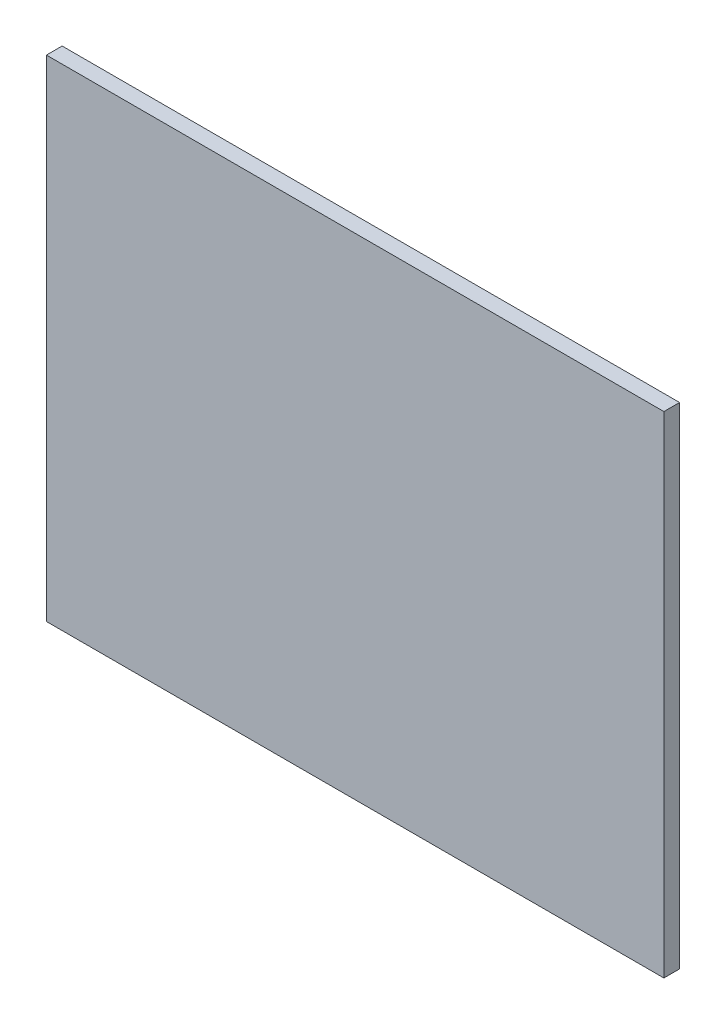
ISO-10303-21;
HEADER;
FILE_DESCRIPTION(('STEP AP214'),'2;1');
FILE_NAME('part.step','',(''),(''),'','','');
FILE_SCHEMA(('AUTOMOTIVE_DESIGN { 1 0 10303 214 1 1 1 1 }'));
ENDSEC;
DATA;
#1=APPLICATION_CONTEXT('core data for automotive mechanical design processes');
#2=APPLICATION_PROTOCOL_DEFINITION('international standard','automotive_design',2000,#1);
#3=PRODUCT_CONTEXT('',#1,'mechanical');
#4=PRODUCT('Part','Part','',(#3));
#5=PRODUCT_RELATED_PRODUCT_CATEGORY('part','',(#4));
#6=PRODUCT_DEFINITION_FORMATION('','',#4);
#7=PRODUCT_DEFINITION_CONTEXT('part definition',#1,'design');
#8=PRODUCT_DEFINITION('design','',#6,#7);
#9=PRODUCT_DEFINITION_SHAPE('','',#8);
#10=(LENGTH_UNIT() NAMED_UNIT(*) SI_UNIT(.MILLI.,.METRE.));
#11=(NAMED_UNIT(*) PLANE_ANGLE_UNIT() SI_UNIT($,.RADIAN.));
#12=(NAMED_UNIT(*) SI_UNIT($,.STERADIAN.) SOLID_ANGLE_UNIT());
#13=UNCERTAINTY_MEASURE_WITH_UNIT(LENGTH_MEASURE(1.E-05),#10,'distance_accuracy_value','');
#14=(GEOMETRIC_REPRESENTATION_CONTEXT(3) GLOBAL_UNCERTAINTY_ASSIGNED_CONTEXT((#13)) GLOBAL_UNIT_ASSIGNED_CONTEXT((#10,
#11,#12)) REPRESENTATION_CONTEXT('',''));
#15=CARTESIAN_POINT('',(0.,0.,0.));
#16=DIRECTION('',(0.,0.,1.));
#17=DIRECTION('',(1.,0.,0.));
#18=AXIS2_PLACEMENT_3D('',#15,#16,#17);
#19=CARTESIAN_POINT('',(236.,-187.5,6.));
#20=DIRECTION('',(-1.,0.,0.));
#21=DIRECTION('',(0.,0.,1.));
#22=AXIS2_PLACEMENT_3D('',#19,#20,#21);
#23=PLANE('',#22);
#24=DIRECTION('',(0.,1.,0.));
#25=VECTOR('',#24,1.);
#26=CARTESIAN_POINT('',(236.,-187.5,-6.));
#27=LINE('',#26,#25);
#28=CARTESIAN_POINT('',(236.,-187.5,-6.));
#29=VERTEX_POINT('',#28);
#30=CARTESIAN_POINT('',(236.,187.5,-6.));
#31=VERTEX_POINT('',#30);
#32=EDGE_CURVE('E100',#29,#31,#27,.T.);
#33=ORIENTED_EDGE('',*,*,#32,.T.);
#34=DIRECTION('',(0.,0.,-1.));
#35=VECTOR('',#34,1.);
#36=CARTESIAN_POINT('',(236.,187.5,6.));
#37=LINE('',#36,#35);
#38=CARTESIAN_POINT('',(236.,187.5,6.));
#39=VERTEX_POINT('',#38);
#40=EDGE_CURVE('E11',#39,#31,#37,.T.);
#41=ORIENTED_EDGE('',*,*,#40,.F.);
#42=DIRECTION('',(0.,1.,0.));
#43=VECTOR('',#42,1.);
#44=CARTESIAN_POINT('',(236.,-187.5,6.));
#45=LINE('',#44,#43);
#46=CARTESIAN_POINT('',(236.,-187.5,6.));
#47=VERTEX_POINT('',#46);
#48=EDGE_CURVE('E87',#47,#39,#45,.T.);
#49=ORIENTED_EDGE('',*,*,#48,.F.);
#50=DIRECTION('',(0.,0.,-1.));
#51=VECTOR('',#50,1.);
#52=CARTESIAN_POINT('',(236.,-187.5,6.));
#53=LINE('',#52,#51);
#54=EDGE_CURVE('E96',#47,#29,#53,.T.);
#55=ORIENTED_EDGE('',*,*,#54,.T.);
#56=EDGE_LOOP('',(#33,#41,#49,#55));
#57=FACE_BOUND('',#56,.T.);
#58=ADVANCED_FACE('F34',(#57),#23,.F.);
#59=CARTESIAN_POINT('',(-236.,187.5,6.));
#60=DIRECTION('',(0.,-1.,0.));
#61=DIRECTION('',(0.,0.,-1.));
#62=AXIS2_PLACEMENT_3D('',#59,#60,#61);
#63=PLANE('',#62);
#64=DIRECTION('',(-1.,0.,0.));
#65=VECTOR('',#64,1.);
#66=CARTESIAN_POINT('',(-236.,187.5,-6.));
#67=LINE('',#66,#65);
#68=CARTESIAN_POINT('',(-236.,187.5,-6.));
#69=VERTEX_POINT('',#68);
#70=EDGE_CURVE('E91',#31,#69,#67,.T.);
#71=ORIENTED_EDGE('',*,*,#70,.T.);
#72=DIRECTION('',(0.,0.,-1.));
#73=VECTOR('',#72,1.);
#74=CARTESIAN_POINT('',(-236.,187.5,6.));
#75=LINE('',#74,#73);
#76=CARTESIAN_POINT('',(-236.,187.5,6.));
#77=VERTEX_POINT('',#76);
#78=EDGE_CURVE('E43',#77,#69,#75,.T.);
#79=ORIENTED_EDGE('',*,*,#78,.F.);
#80=DIRECTION('',(-1.,0.,0.));
#81=VECTOR('',#80,1.);
#82=CARTESIAN_POINT('',(-236.,187.5,6.));
#83=LINE('',#82,#81);
#84=EDGE_CURVE('E82',#39,#77,#83,.T.);
#85=ORIENTED_EDGE('',*,*,#84,.F.);
#86=ORIENTED_EDGE('',*,*,#40,.T.);
#87=EDGE_LOOP('',(#71,#79,#85,#86));
#88=FACE_BOUND('',#87,.T.);
#89=ADVANCED_FACE('F90',(#88),#63,.F.);
#90=CARTESIAN_POINT('',(-236.,-187.5,6.));
#91=DIRECTION('',(1.,0.,0.));
#92=DIRECTION('',(0.,0.,-1.));
#93=AXIS2_PLACEMENT_3D('',#90,#91,#92);
#94=PLANE('',#93);
#95=DIRECTION('',(0.,-1.,0.));
#96=VECTOR('',#95,1.);
#97=CARTESIAN_POINT('',(-236.,-187.5,-6.));
#98=LINE('',#97,#96);
#99=CARTESIAN_POINT('',(-236.,-187.5,-6.));
#100=VERTEX_POINT('',#99);
#101=EDGE_CURVE('E69',#69,#100,#98,.T.);
#102=ORIENTED_EDGE('',*,*,#101,.T.);
#103=DIRECTION('',(0.,0.,-1.));
#104=VECTOR('',#103,1.);
#105=CARTESIAN_POINT('',(-236.,-187.5,6.));
#106=LINE('',#105,#104);
#107=CARTESIAN_POINT('',(-236.,-187.5,6.));
#108=VERTEX_POINT('',#107);
#109=EDGE_CURVE('E92',#108,#100,#106,.T.);
#110=ORIENTED_EDGE('',*,*,#109,.F.);
#111=DIRECTION('',(0.,-1.,0.));
#112=VECTOR('',#111,1.);
#113=CARTESIAN_POINT('',(-236.,-187.5,6.));
#114=LINE('',#113,#112);
#115=EDGE_CURVE('E85',#77,#108,#114,.T.);
#116=ORIENTED_EDGE('',*,*,#115,.F.);
#117=ORIENTED_EDGE('',*,*,#78,.T.);
#118=EDGE_LOOP('',(#102,#110,#116,#117));
#119=FACE_BOUND('',#118,.T.);
#120=ADVANCED_FACE('F94',(#119),#94,.F.);
#121=CARTESIAN_POINT('',(-236.,-187.5,6.));
#122=DIRECTION('',(0.,1.,0.));
#123=DIRECTION('',(0.,0.,1.));
#124=AXIS2_PLACEMENT_3D('',#121,#122,#123);
#125=PLANE('',#124);
#126=DIRECTION('',(1.,0.,0.));
#127=VECTOR('',#126,1.);
#128=CARTESIAN_POINT('',(-236.,-187.5,-6.));
#129=LINE('',#128,#127);
#130=EDGE_CURVE('E75',#100,#29,#129,.T.);
#131=ORIENTED_EDGE('',*,*,#130,.T.);
#132=ORIENTED_EDGE('',*,*,#54,.F.);
#133=DIRECTION('',(1.,0.,0.));
#134=VECTOR('',#133,1.);
#135=CARTESIAN_POINT('',(-236.,-187.5,6.));
#136=LINE('',#135,#134);
#137=EDGE_CURVE('E52',#108,#47,#136,.T.);
#138=ORIENTED_EDGE('',*,*,#137,.F.);
#139=ORIENTED_EDGE('',*,*,#109,.T.);
#140=EDGE_LOOP('',(#131,#132,#138,#139));
#141=FACE_BOUND('',#140,.T.);
#142=ADVANCED_FACE('F210',(#141),#125,.F.);
#143=CARTESIAN_POINT('',(0.,0.,6.));
#144=DIRECTION('',(0.,0.,-1.));
#145=DIRECTION('',(-1.,0.,0.));
#146=AXIS2_PLACEMENT_3D('',#143,#144,#145);
#147=PLANE('',#146);
#148=ORIENTED_EDGE('',*,*,#48,.T.);
#149=ORIENTED_EDGE('',*,*,#84,.T.);
#150=ORIENTED_EDGE('',*,*,#115,.T.);
#151=ORIENTED_EDGE('',*,*,#137,.T.);
#152=EDGE_LOOP('',(#148,#149,#150,#151));
#153=FACE_BOUND('',#152,.T.);
#154=ADVANCED_FACE('F83',(#153),#147,.F.);
#155=CARTESIAN_POINT('',(0.,0.,-6.));
#156=DIRECTION('',(0.,0.,-1.));
#157=DIRECTION('',(-1.,0.,0.));
#158=AXIS2_PLACEMENT_3D('',#155,#156,#157);
#159=PLANE('',#158);
#160=CARTESIAN_POINT('',(230.000000000001,140.,-6.));
#161=DIRECTION('',(0.,0.,-1.));
#162=DIRECTION('',(-1.,0.,0.));
#163=AXIS2_PLACEMENT_3D('',#160,#161,#162);
#164=CIRCLE('',#163,2.99999999999999);
#165=CARTESIAN_POINT('',(227.000000000001,140.,-6.));
#166=VERTEX_POINT('',#165);
#167=EDGE_CURVE('E37',#166,#166,#164,.T.);
#168=ORIENTED_EDGE('',*,*,#167,.F.);
#169=EDGE_LOOP('',(#168));
#170=FACE_BOUND('',#169,.T.);
#171=CARTESIAN_POINT('',(230.,70.,-6.));
#172=DIRECTION('',(0.,0.,-1.));
#173=DIRECTION('',(-1.,0.,0.));
#174=AXIS2_PLACEMENT_3D('',#171,#172,#173);
#175=CIRCLE('',#174,2.99999999999999);
#176=CARTESIAN_POINT('',(227.,70.,-6.));
#177=VERTEX_POINT('',#176);
#178=EDGE_CURVE('E147',#177,#177,#175,.T.);
#179=ORIENTED_EDGE('',*,*,#178,.F.);
#180=EDGE_LOOP('',(#179));
#181=FACE_BOUND('',#180,.T.);
#182=CARTESIAN_POINT('',(230.,-70.,-6.));
#183=DIRECTION('',(0.,0.,-1.));
#184=DIRECTION('',(-1.,0.,0.));
#185=AXIS2_PLACEMENT_3D('',#182,#183,#184);
#186=CIRCLE('',#185,2.99999999999999);
#187=CARTESIAN_POINT('',(227.,-70.,-6.));
#188=VERTEX_POINT('',#187);
#189=EDGE_CURVE('E144',#188,#188,#186,.T.);
#190=ORIENTED_EDGE('',*,*,#189,.F.);
#191=EDGE_LOOP('',(#190));
#192=FACE_BOUND('',#191,.T.);
#193=CARTESIAN_POINT('',(230.000000000001,-140.,-6.));
#194=DIRECTION('',(0.,0.,-1.));
#195=DIRECTION('',(-1.,0.,0.));
#196=AXIS2_PLACEMENT_3D('',#193,#194,#195);
#197=CIRCLE('',#196,2.99999999999999);
#198=CARTESIAN_POINT('',(227.000000000001,-140.,-6.));
#199=VERTEX_POINT('',#198);
#200=EDGE_CURVE('E140',#199,#199,#197,.T.);
#201=ORIENTED_EDGE('',*,*,#200,.F.);
#202=EDGE_LOOP('',(#201));
#203=FACE_BOUND('',#202,.T.);
#204=CARTESIAN_POINT('',(-230.,-70.,-6.));
#205=DIRECTION('',(0.,0.,-1.));
#206=DIRECTION('',(-1.,0.,0.));
#207=AXIS2_PLACEMENT_3D('',#204,#205,#206);
#208=CIRCLE('',#207,2.99999999999999);
#209=CARTESIAN_POINT('',(-233.,-70.,-6.));
#210=VERTEX_POINT('',#209);
#211=EDGE_CURVE('E136',#210,#210,#208,.T.);
#212=ORIENTED_EDGE('',*,*,#211,.F.);
#213=EDGE_LOOP('',(#212));
#214=FACE_BOUND('',#213,.T.);
#215=CARTESIAN_POINT('',(-230.,-140.,-6.));
#216=DIRECTION('',(0.,0.,-1.));
#217=DIRECTION('',(-1.,0.,0.));
#218=AXIS2_PLACEMENT_3D('',#215,#216,#217);
#219=CIRCLE('',#218,2.99999999999999);
#220=CARTESIAN_POINT('',(-233.,-140.,-6.));
#221=VERTEX_POINT('',#220);
#222=EDGE_CURVE('E132',#221,#221,#219,.T.);
#223=ORIENTED_EDGE('',*,*,#222,.F.);
#224=EDGE_LOOP('',(#223));
#225=FACE_BOUND('',#224,.T.);
#226=CARTESIAN_POINT('',(182.712951508879,181.5,-6.));
#227=DIRECTION('',(0.,0.,-1.));
#228=DIRECTION('',(-1.,0.,0.));
#229=AXIS2_PLACEMENT_3D('',#226,#227,#228);
#230=CIRCLE('',#229,2.99999999999999);
#231=CARTESIAN_POINT('',(179.712951508879,181.5,-6.));
#232=VERTEX_POINT('',#231);
#233=EDGE_CURVE('E128',#232,#232,#230,.T.);
#234=ORIENTED_EDGE('',*,*,#233,.F.);
#235=EDGE_LOOP('',(#234));
#236=FACE_BOUND('',#235,.T.);
#237=CARTESIAN_POINT('',(-92.7129515088792,181.5,-6.));
#238=DIRECTION('',(0.,0.,-1.));
#239=DIRECTION('',(-1.,0.,0.));
#240=AXIS2_PLACEMENT_3D('',#237,#238,#239);
#241=CIRCLE('',#240,2.99999999999999);
#242=CARTESIAN_POINT('',(-95.7129515088792,181.5,-6.));
#243=VERTEX_POINT('',#242);
#244=EDGE_CURVE('E124',#243,#243,#241,.T.);
#245=ORIENTED_EDGE('',*,*,#244,.F.);
#246=EDGE_LOOP('',(#245));
#247=FACE_BOUND('',#246,.T.);
#248=CARTESIAN_POINT('',(92.7129515088793,181.5,-6.));
#249=DIRECTION('',(0.,0.,-1.));
#250=DIRECTION('',(-1.,0.,0.));
#251=AXIS2_PLACEMENT_3D('',#248,#249,#250);
#252=CIRCLE('',#251,2.99999999999999);
#253=CARTESIAN_POINT('',(89.7129515088794,181.5,-6.));
#254=VERTEX_POINT('',#253);
#255=EDGE_CURVE('E120',#254,#254,#252,.T.);
#256=ORIENTED_EDGE('',*,*,#255,.F.);
#257=EDGE_LOOP('',(#256));
#258=FACE_BOUND('',#257,.T.);
#259=CARTESIAN_POINT('',(-182.712951508879,181.5,-6.));
#260=DIRECTION('',(0.,0.,-1.));
#261=DIRECTION('',(-1.,0.,0.));
#262=AXIS2_PLACEMENT_3D('',#259,#260,#261);
#263=CIRCLE('',#262,2.99999999999999);
#264=CARTESIAN_POINT('',(-185.712951508879,181.5,-6.));
#265=VERTEX_POINT('',#264);
#266=EDGE_CURVE('E116',#265,#265,#263,.T.);
#267=ORIENTED_EDGE('',*,*,#266,.F.);
#268=EDGE_LOOP('',(#267));
#269=FACE_BOUND('',#268,.T.);
#270=CARTESIAN_POINT('',(-230.,140.,-6.));
#271=DIRECTION('',(0.,0.,-1.));
#272=DIRECTION('',(-1.,0.,0.));
#273=AXIS2_PLACEMENT_3D('',#270,#271,#272);
#274=CIRCLE('',#273,2.99999999999999);
#275=CARTESIAN_POINT('',(-233.,140.,-6.));
#276=VERTEX_POINT('',#275);
#277=EDGE_CURVE('E112',#276,#276,#274,.T.);
#278=ORIENTED_EDGE('',*,*,#277,.F.);
#279=EDGE_LOOP('',(#278));
#280=FACE_BOUND('',#279,.T.);
#281=CARTESIAN_POINT('',(-230.,70.,-6.));
#282=DIRECTION('',(0.,0.,-1.));
#283=DIRECTION('',(-1.,0.,0.));
#284=AXIS2_PLACEMENT_3D('',#281,#282,#283);
#285=CIRCLE('',#284,2.99999999999999);
#286=CARTESIAN_POINT('',(-233.,70.,-6.));
#287=VERTEX_POINT('',#286);
#288=EDGE_CURVE('E103',#287,#287,#285,.T.);
#289=ORIENTED_EDGE('',*,*,#288,.F.);
#290=EDGE_LOOP('',(#289));
#291=FACE_BOUND('',#290,.T.);
#292=ORIENTED_EDGE('',*,*,#32,.F.);
#293=ORIENTED_EDGE('',*,*,#130,.F.);
#294=ORIENTED_EDGE('',*,*,#101,.F.);
#295=ORIENTED_EDGE('',*,*,#70,.F.);
#296=EDGE_LOOP('',(#292,#293,#294,#295));
#297=FACE_BOUND('',#296,.T.);
#298=ADVANCED_FACE('F194',(#170,#181,#192,#203,#214,#225,#236,#247,#258,#269,#280,#291,#297),
#159,.T.);
#299=CARTESIAN_POINT('',(-230.,70.,-12.));
#300=DIRECTION('',(0.,0.,1.));
#301=DIRECTION('',(1.,0.,0.));
#302=AXIS2_PLACEMENT_3D('',#299,#300,#301);
#303=CYLINDRICAL_SURFACE('',#302,2.99999999999999);
#304=ORIENTED_EDGE('',*,*,#288,.T.);
#305=EDGE_LOOP('',(#304));
#306=FACE_BOUND('',#305,.T.);
#307=CARTESIAN_POINT('',(-230.,70.,0.));
#308=DIRECTION('',(0.,0.,1.));
#309=DIRECTION('',(1.,0.,0.));
#310=AXIS2_PLACEMENT_3D('',#307,#308,#309);
#311=CIRCLE('',#310,2.99999999999999);
#312=CARTESIAN_POINT('',(-227.,70.,0.));
#313=VERTEX_POINT('',#312);
#314=EDGE_CURVE('E111',#313,#313,#311,.T.);
#315=ORIENTED_EDGE('',*,*,#314,.T.);
#316=EDGE_LOOP('',(#315));
#317=FACE_BOUND('',#316,.T.);
#318=ADVANCED_FACE('F181',(#306,#317),#303,.F.);
#319=CARTESIAN_POINT('',(-230.,70.,0.));
#320=DIRECTION('',(0.,0.,1.));
#321=DIRECTION('',(1.,0.,0.));
#322=AXIS2_PLACEMENT_3D('',#319,#320,#321);
#323=PLANE('',#322);
#324=ORIENTED_EDGE('',*,*,#314,.F.);
#325=EDGE_LOOP('',(#324));
#326=FACE_BOUND('',#325,.T.);
#327=ADVANCED_FACE('F183',(#326),#323,.F.);
#328=CARTESIAN_POINT('',(-230.,140.,-12.));
#329=DIRECTION('',(0.,0.,1.));
#330=DIRECTION('',(1.,0.,0.));
#331=AXIS2_PLACEMENT_3D('',#328,#329,#330);
#332=CYLINDRICAL_SURFACE('',#331,2.99999999999999);
#333=ORIENTED_EDGE('',*,*,#277,.T.);
#334=EDGE_LOOP('',(#333));
#335=FACE_BOUND('',#334,.T.);
#336=CARTESIAN_POINT('',(-230.,140.,0.));
#337=DIRECTION('',(0.,0.,1.));
#338=DIRECTION('',(1.,0.,0.));
#339=AXIS2_PLACEMENT_3D('',#336,#337,#338);
#340=CIRCLE('',#339,2.99999999999999);
#341=CARTESIAN_POINT('',(-227.,140.,0.));
#342=VERTEX_POINT('',#341);
#343=EDGE_CURVE('E115',#342,#342,#340,.T.);
#344=ORIENTED_EDGE('',*,*,#343,.T.);
#345=EDGE_LOOP('',(#344));
#346=FACE_BOUND('',#345,.T.);
#347=ADVANCED_FACE('F185',(#335,#346),#332,.F.);
#348=CARTESIAN_POINT('',(-230.,140.,0.));
#349=DIRECTION('',(0.,0.,1.));
#350=DIRECTION('',(1.,0.,0.));
#351=AXIS2_PLACEMENT_3D('',#348,#349,#350);
#352=PLANE('',#351);
#353=ORIENTED_EDGE('',*,*,#343,.F.);
#354=EDGE_LOOP('',(#353));
#355=FACE_BOUND('',#354,.T.);
#356=ADVANCED_FACE('F191',(#355),#352,.F.);
#357=CARTESIAN_POINT('',(-182.712951508879,181.5,-12.));
#358=DIRECTION('',(0.,0.,1.));
#359=DIRECTION('',(1.,0.,0.));
#360=AXIS2_PLACEMENT_3D('',#357,#358,#359);
#361=CYLINDRICAL_SURFACE('',#360,2.99999999999999);
#362=ORIENTED_EDGE('',*,*,#266,.T.);
#363=EDGE_LOOP('',(#362));
#364=FACE_BOUND('',#363,.T.);
#365=CARTESIAN_POINT('',(-182.712951508879,181.5,0.));
#366=DIRECTION('',(0.,0.,1.));
#367=DIRECTION('',(1.,0.,0.));
#368=AXIS2_PLACEMENT_3D('',#365,#366,#367);
#369=CIRCLE('',#368,2.99999999999999);
#370=CARTESIAN_POINT('',(-179.712951508879,181.5,0.));
#371=VERTEX_POINT('',#370);
#372=EDGE_CURVE('E119',#371,#371,#369,.T.);
#373=ORIENTED_EDGE('',*,*,#372,.T.);
#374=EDGE_LOOP('',(#373));
#375=FACE_BOUND('',#374,.T.);
#376=ADVANCED_FACE('F259',(#364,#375),#361,.F.);
#377=CARTESIAN_POINT('',(-182.712951508879,181.5,0.));
#378=DIRECTION('',(0.,0.,1.));
#379=DIRECTION('',(1.,0.,0.));
#380=AXIS2_PLACEMENT_3D('',#377,#378,#379);
#381=PLANE('',#380);
#382=ORIENTED_EDGE('',*,*,#372,.F.);
#383=EDGE_LOOP('',(#382));
#384=FACE_BOUND('',#383,.T.);
#385=ADVANCED_FACE('F269',(#384),#381,.F.);
#386=CARTESIAN_POINT('',(92.7129515088793,181.5,-12.));
#387=DIRECTION('',(0.,0.,1.));
#388=DIRECTION('',(1.,0.,0.));
#389=AXIS2_PLACEMENT_3D('',#386,#387,#388);
#390=CYLINDRICAL_SURFACE('',#389,2.99999999999999);
#391=ORIENTED_EDGE('',*,*,#255,.T.);
#392=EDGE_LOOP('',(#391));
#393=FACE_BOUND('',#392,.T.);
#394=CARTESIAN_POINT('',(92.7129515088793,181.5,0.));
#395=DIRECTION('',(0.,0.,1.));
#396=DIRECTION('',(-1.,0.,0.));
#397=AXIS2_PLACEMENT_3D('',#394,#395,#396);
#398=CIRCLE('',#397,2.99999999999999);
#399=CARTESIAN_POINT('',(89.7129515088794,181.5,0.));
#400=VERTEX_POINT('',#399);
#401=EDGE_CURVE('E123',#400,#400,#398,.T.);
#402=ORIENTED_EDGE('',*,*,#401,.T.);
#403=EDGE_LOOP('',(#402));
#404=FACE_BOUND('',#403,.T.);
#405=ADVANCED_FACE('F279',(#393,#404),#390,.F.);
#406=CARTESIAN_POINT('',(92.7129515088793,181.5,0.));
#407=DIRECTION('',(0.,0.,-1.));
#408=DIRECTION('',(-1.,0.,0.));
#409=AXIS2_PLACEMENT_3D('',#406,#407,#408);
#410=PLANE('',#409);
#411=ORIENTED_EDGE('',*,*,#401,.F.);
#412=EDGE_LOOP('',(#411));
#413=FACE_BOUND('',#412,.T.);
#414=ADVANCED_FACE('F289',(#413),#410,.T.);
#415=CARTESIAN_POINT('',(-92.7129515088792,181.5,-12.));
#416=DIRECTION('',(0.,0.,1.));
#417=DIRECTION('',(1.,0.,0.));
#418=AXIS2_PLACEMENT_3D('',#415,#416,#417);
#419=CYLINDRICAL_SURFACE('',#418,2.99999999999999);
#420=ORIENTED_EDGE('',*,*,#244,.T.);
#421=EDGE_LOOP('',(#420));
#422=FACE_BOUND('',#421,.T.);
#423=CARTESIAN_POINT('',(-92.7129515088792,181.5,0.));
#424=DIRECTION('',(0.,0.,1.));
#425=DIRECTION('',(1.,0.,0.));
#426=AXIS2_PLACEMENT_3D('',#423,#424,#425);
#427=CIRCLE('',#426,2.99999999999999);
#428=CARTESIAN_POINT('',(-89.7129515088792,181.5,0.));
#429=VERTEX_POINT('',#428);
#430=EDGE_CURVE('E127',#429,#429,#427,.T.);
#431=ORIENTED_EDGE('',*,*,#430,.T.);
#432=EDGE_LOOP('',(#431));
#433=FACE_BOUND('',#432,.T.);
#434=ADVANCED_FACE('F299',(#422,#433),#419,.F.);
#435=CARTESIAN_POINT('',(-92.7129515088792,181.5,0.));
#436=DIRECTION('',(0.,0.,1.));
#437=DIRECTION('',(1.,0.,0.));
#438=AXIS2_PLACEMENT_3D('',#435,#436,#437);
#439=PLANE('',#438);
#440=ORIENTED_EDGE('',*,*,#430,.F.);
#441=EDGE_LOOP('',(#440));
#442=FACE_BOUND('',#441,.T.);
#443=ADVANCED_FACE('F309',(#442),#439,.F.);
#444=CARTESIAN_POINT('',(182.712951508879,181.5,-12.));
#445=DIRECTION('',(0.,0.,1.));
#446=DIRECTION('',(1.,0.,0.));
#447=AXIS2_PLACEMENT_3D('',#444,#445,#446);
#448=CYLINDRICAL_SURFACE('',#447,2.99999999999999);
#449=ORIENTED_EDGE('',*,*,#233,.T.);
#450=EDGE_LOOP('',(#449));
#451=FACE_BOUND('',#450,.T.);
#452=CARTESIAN_POINT('',(182.712951508879,181.5,0.));
#453=DIRECTION('',(0.,0.,1.));
#454=DIRECTION('',(-1.,0.,0.));
#455=AXIS2_PLACEMENT_3D('',#452,#453,#454);
#456=CIRCLE('',#455,2.99999999999999);
#457=CARTESIAN_POINT('',(179.712951508879,181.5,0.));
#458=VERTEX_POINT('',#457);
#459=EDGE_CURVE('E131',#458,#458,#456,.T.);
#460=ORIENTED_EDGE('',*,*,#459,.T.);
#461=EDGE_LOOP('',(#460));
#462=FACE_BOUND('',#461,.T.);
#463=ADVANCED_FACE('F319',(#451,#462),#448,.F.);
#464=CARTESIAN_POINT('',(182.712951508879,181.5,0.));
#465=DIRECTION('',(0.,0.,-1.));
#466=DIRECTION('',(-1.,0.,0.));
#467=AXIS2_PLACEMENT_3D('',#464,#465,#466);
#468=PLANE('',#467);
#469=ORIENTED_EDGE('',*,*,#459,.F.);
#470=EDGE_LOOP('',(#469));
#471=FACE_BOUND('',#470,.T.);
#472=ADVANCED_FACE('F329',(#471),#468,.T.);
#473=CARTESIAN_POINT('',(-230.,-140.,-12.));
#474=DIRECTION('',(0.,0.,1.));
#475=DIRECTION('',(1.,0.,0.));
#476=AXIS2_PLACEMENT_3D('',#473,#474,#475);
#477=CYLINDRICAL_SURFACE('',#476,2.99999999999999);
#478=ORIENTED_EDGE('',*,*,#222,.T.);
#479=EDGE_LOOP('',(#478));
#480=FACE_BOUND('',#479,.T.);
#481=CARTESIAN_POINT('',(-230.,-140.,0.));
#482=DIRECTION('',(0.,0.,1.));
#483=DIRECTION('',(-1.,0.,0.));
#484=AXIS2_PLACEMENT_3D('',#481,#482,#483);
#485=CIRCLE('',#484,2.99999999999999);
#486=CARTESIAN_POINT('',(-233.,-140.,0.));
#487=VERTEX_POINT('',#486);
#488=EDGE_CURVE('E135',#487,#487,#485,.T.);
#489=ORIENTED_EDGE('',*,*,#488,.T.);
#490=EDGE_LOOP('',(#489));
#491=FACE_BOUND('',#490,.T.);
#492=ADVANCED_FACE('F339',(#480,#491),#477,.F.);
#493=CARTESIAN_POINT('',(-230.,-140.,0.));
#494=DIRECTION('',(0.,0.,-1.));
#495=DIRECTION('',(-1.,0.,0.));
#496=AXIS2_PLACEMENT_3D('',#493,#494,#495);
#497=PLANE('',#496);
#498=ORIENTED_EDGE('',*,*,#488,.F.);
#499=EDGE_LOOP('',(#498));
#500=FACE_BOUND('',#499,.T.);
#501=ADVANCED_FACE('F349',(#500),#497,.T.);
#502=CARTESIAN_POINT('',(-230.,-70.,-12.));
#503=DIRECTION('',(0.,0.,1.));
#504=DIRECTION('',(1.,0.,0.));
#505=AXIS2_PLACEMENT_3D('',#502,#503,#504);
#506=CYLINDRICAL_SURFACE('',#505,2.99999999999999);
#507=ORIENTED_EDGE('',*,*,#211,.T.);
#508=EDGE_LOOP('',(#507));
#509=FACE_BOUND('',#508,.T.);
#510=CARTESIAN_POINT('',(-230.,-70.,0.));
#511=DIRECTION('',(0.,0.,1.));
#512=DIRECTION('',(-1.,0.,0.));
#513=AXIS2_PLACEMENT_3D('',#510,#511,#512);
#514=CIRCLE('',#513,2.99999999999999);
#515=CARTESIAN_POINT('',(-233.,-70.,0.));
#516=VERTEX_POINT('',#515);
#517=EDGE_CURVE('E139',#516,#516,#514,.T.);
#518=ORIENTED_EDGE('',*,*,#517,.T.);
#519=EDGE_LOOP('',(#518));
#520=FACE_BOUND('',#519,.T.);
#521=ADVANCED_FACE('F359',(#509,#520),#506,.F.);
#522=CARTESIAN_POINT('',(-230.,-70.,0.));
#523=DIRECTION('',(0.,0.,-1.));
#524=DIRECTION('',(-1.,0.,0.));
#525=AXIS2_PLACEMENT_3D('',#522,#523,#524);
#526=PLANE('',#525);
#527=ORIENTED_EDGE('',*,*,#517,.F.);
#528=EDGE_LOOP('',(#527));
#529=FACE_BOUND('',#528,.T.);
#530=ADVANCED_FACE('F369',(#529),#526,.T.);
#531=CARTESIAN_POINT('',(230.000000000001,-140.,-12.));
#532=DIRECTION('',(0.,0.,1.));
#533=DIRECTION('',(1.,0.,0.));
#534=AXIS2_PLACEMENT_3D('',#531,#532,#533);
#535=CYLINDRICAL_SURFACE('',#534,2.99999999999999);
#536=ORIENTED_EDGE('',*,*,#200,.T.);
#537=EDGE_LOOP('',(#536));
#538=FACE_BOUND('',#537,.T.);
#539=CARTESIAN_POINT('',(230.000000000001,-140.,0.));
#540=DIRECTION('',(0.,0.,1.));
#541=DIRECTION('',(1.,0.,0.));
#542=AXIS2_PLACEMENT_3D('',#539,#540,#541);
#543=CIRCLE('',#542,2.99999999999999);
#544=CARTESIAN_POINT('',(233.000000000001,-140.,0.));
#545=VERTEX_POINT('',#544);
#546=EDGE_CURVE('E143',#545,#545,#543,.T.);
#547=ORIENTED_EDGE('',*,*,#546,.T.);
#548=EDGE_LOOP('',(#547));
#549=FACE_BOUND('',#548,.T.);
#550=ADVANCED_FACE('F379',(#538,#549),#535,.F.);
#551=CARTESIAN_POINT('',(230.000000000001,-140.,0.));
#552=DIRECTION('',(0.,0.,1.));
#553=DIRECTION('',(1.,0.,0.));
#554=AXIS2_PLACEMENT_3D('',#551,#552,#553);
#555=PLANE('',#554);
#556=ORIENTED_EDGE('',*,*,#546,.F.);
#557=EDGE_LOOP('',(#556));
#558=FACE_BOUND('',#557,.T.);
#559=ADVANCED_FACE('F389',(#558),#555,.F.);
#560=CARTESIAN_POINT('',(230.,-70.,-12.));
#561=DIRECTION('',(0.,0.,1.));
#562=DIRECTION('',(1.,0.,0.));
#563=AXIS2_PLACEMENT_3D('',#560,#561,#562);
#564=CYLINDRICAL_SURFACE('',#563,2.99999999999999);
#565=ORIENTED_EDGE('',*,*,#189,.T.);
#566=EDGE_LOOP('',(#565));
#567=FACE_BOUND('',#566,.T.);
#568=CARTESIAN_POINT('',(230.,-70.,0.));
#569=DIRECTION('',(0.,0.,1.));
#570=DIRECTION('',(1.,0.,0.));
#571=AXIS2_PLACEMENT_3D('',#568,#569,#570);
#572=CIRCLE('',#571,2.99999999999999);
#573=CARTESIAN_POINT('',(233.,-70.,0.));
#574=VERTEX_POINT('',#573);
#575=EDGE_CURVE('E146',#574,#574,#572,.T.);
#576=ORIENTED_EDGE('',*,*,#575,.T.);
#577=EDGE_LOOP('',(#576));
#578=FACE_BOUND('',#577,.T.);
#579=ADVANCED_FACE('F399',(#567,#578),#564,.F.);
#580=CARTESIAN_POINT('',(230.,-70.,0.));
#581=DIRECTION('',(0.,0.,1.));
#582=DIRECTION('',(1.,0.,0.));
#583=AXIS2_PLACEMENT_3D('',#580,#581,#582);
#584=PLANE('',#583);
#585=ORIENTED_EDGE('',*,*,#575,.F.);
#586=EDGE_LOOP('',(#585));
#587=FACE_BOUND('',#586,.T.);
#588=ADVANCED_FACE('F409',(#587),#584,.F.);
#589=CARTESIAN_POINT('',(230.,70.,-12.));
#590=DIRECTION('',(0.,0.,1.));
#591=DIRECTION('',(1.,0.,0.));
#592=AXIS2_PLACEMENT_3D('',#589,#590,#591);
#593=CYLINDRICAL_SURFACE('',#592,2.99999999999999);
#594=ORIENTED_EDGE('',*,*,#178,.T.);
#595=EDGE_LOOP('',(#594));
#596=FACE_BOUND('',#595,.T.);
#597=CARTESIAN_POINT('',(230.,70.,0.));
#598=DIRECTION('',(0.,0.,1.));
#599=DIRECTION('',(-1.,0.,0.));
#600=AXIS2_PLACEMENT_3D('',#597,#598,#599);
#601=CIRCLE('',#600,2.99999999999999);
#602=CARTESIAN_POINT('',(227.,70.,0.));
#603=VERTEX_POINT('',#602);
#604=EDGE_CURVE('E149',#603,#603,#601,.T.);
#605=ORIENTED_EDGE('',*,*,#604,.T.);
#606=EDGE_LOOP('',(#605));
#607=FACE_BOUND('',#606,.T.);
#608=ADVANCED_FACE('F419',(#596,#607),#593,.F.);
#609=CARTESIAN_POINT('',(230.,70.,0.));
#610=DIRECTION('',(0.,0.,-1.));
#611=DIRECTION('',(-1.,0.,0.));
#612=AXIS2_PLACEMENT_3D('',#609,#610,#611);
#613=PLANE('',#612);
#614=ORIENTED_EDGE('',*,*,#604,.F.);
#615=EDGE_LOOP('',(#614));
#616=FACE_BOUND('',#615,.T.);
#617=ADVANCED_FACE('F429',(#616),#613,.T.);
#618=CARTESIAN_POINT('',(230.000000000001,140.,-12.));
#619=DIRECTION('',(0.,0.,1.));
#620=DIRECTION('',(1.,0.,0.));
#621=AXIS2_PLACEMENT_3D('',#618,#619,#620);
#622=CYLINDRICAL_SURFACE('',#621,2.99999999999999);
#623=ORIENTED_EDGE('',*,*,#167,.T.);
#624=EDGE_LOOP('',(#623));
#625=FACE_BOUND('',#624,.T.);
#626=CARTESIAN_POINT('',(230.000000000001,140.,0.));
#627=DIRECTION('',(0.,0.,1.));
#628=DIRECTION('',(-1.,0.,0.));
#629=AXIS2_PLACEMENT_3D('',#626,#627,#628);
#630=CIRCLE('',#629,2.99999999999999);
#631=CARTESIAN_POINT('',(227.000000000001,140.,0.));
#632=VERTEX_POINT('',#631);
#633=EDGE_CURVE('E159',#632,#632,#630,.T.);
#634=ORIENTED_EDGE('',*,*,#633,.T.);
#635=EDGE_LOOP('',(#634));
#636=FACE_BOUND('',#635,.T.);
#637=ADVANCED_FACE('F438',(#625,#636),#622,.F.);
#638=CARTESIAN_POINT('',(230.000000000001,140.,0.));
#639=DIRECTION('',(0.,0.,-1.));
#640=DIRECTION('',(-1.,0.,0.));
#641=AXIS2_PLACEMENT_3D('',#638,#639,#640);
#642=PLANE('',#641);
#643=ORIENTED_EDGE('',*,*,#633,.F.);
#644=EDGE_LOOP('',(#643));
#645=FACE_BOUND('',#644,.T.);
#646=ADVANCED_FACE('F448',(#645),#642,.T.);
#647=CLOSED_SHELL('',(#58,#89,#120,#142,#154,#298,#318,#327,#347,#356,#376,#385,#405,#414,#434,
#443,#463,#472,#492,#501,#521,#530,#550,#559,#579,#588,#608,#617,#637,#646));
#648=MANIFOLD_SOLID_BREP('B2',#647);
#649=ADVANCED_BREP_SHAPE_REPRESENTATION('',(#18,#648),#14);
#650=SHAPE_DEFINITION_REPRESENTATION(#9,#649);
ENDSEC;
END-ISO-10303-21;
